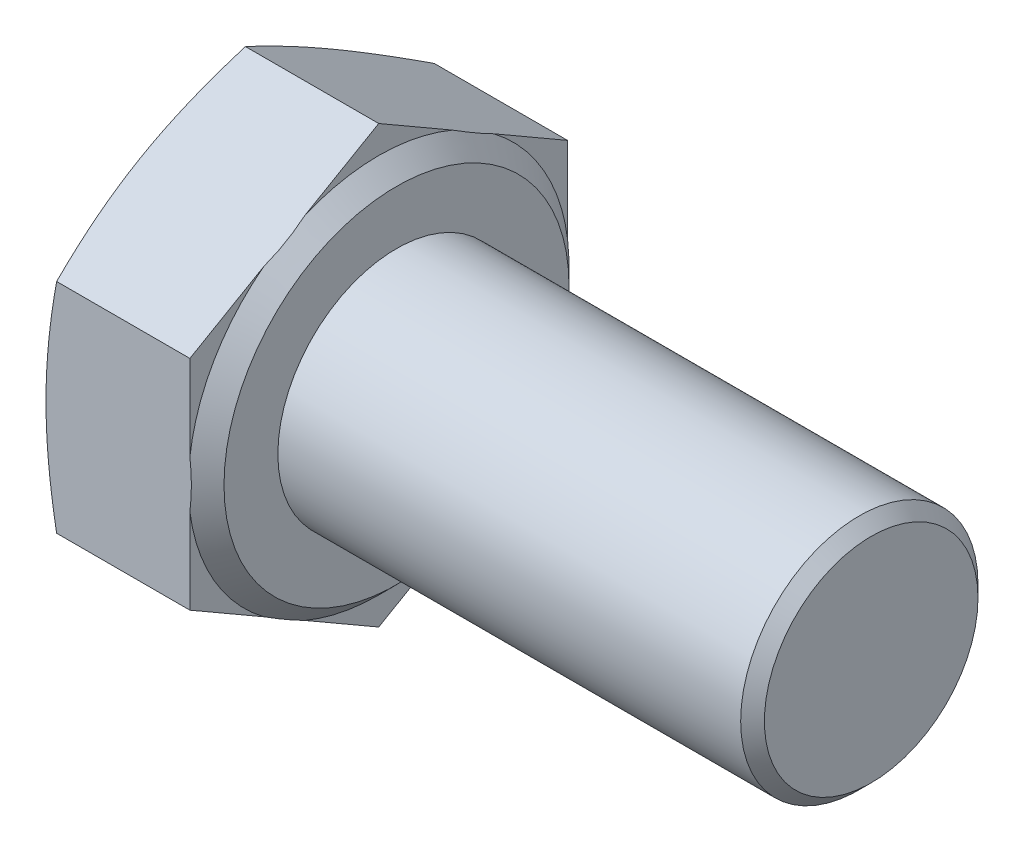
ISO-10303-21;
HEADER;
FILE_DESCRIPTION(('STEP AP214'),'2;1');
FILE_NAME('part.step','',(''),(''),'','','');
FILE_SCHEMA(('AUTOMOTIVE_DESIGN { 1 0 10303 214 1 1 1 1 }'));
ENDSEC;
DATA;
#1=APPLICATION_CONTEXT('core data for automotive mechanical design processes');
#2=APPLICATION_PROTOCOL_DEFINITION('international standard','automotive_design',2000,#1);
#3=PRODUCT_CONTEXT('',#1,'mechanical');
#4=PRODUCT('Part','Part','',(#3));
#5=PRODUCT_RELATED_PRODUCT_CATEGORY('part','',(#4));
#6=PRODUCT_DEFINITION_FORMATION('','',#4);
#7=PRODUCT_DEFINITION_CONTEXT('part definition',#1,'design');
#8=PRODUCT_DEFINITION('design','',#6,#7);
#9=PRODUCT_DEFINITION_SHAPE('','',#8);
#10=(LENGTH_UNIT() NAMED_UNIT(*) SI_UNIT(.MILLI.,.METRE.));
#11=(NAMED_UNIT(*) PLANE_ANGLE_UNIT() SI_UNIT($,.RADIAN.));
#12=(NAMED_UNIT(*) SI_UNIT($,.STERADIAN.) SOLID_ANGLE_UNIT());
#13=UNCERTAINTY_MEASURE_WITH_UNIT(LENGTH_MEASURE(1.E-05),#10,'distance_accuracy_value','');
#14=(GEOMETRIC_REPRESENTATION_CONTEXT(3) GLOBAL_UNCERTAINTY_ASSIGNED_CONTEXT((#13)) GLOBAL_UNIT_ASSIGNED_CONTEXT((#10,
#11,#12)) REPRESENTATION_CONTEXT('',''));
#15=CARTESIAN_POINT('',(0.,0.,0.));
#16=DIRECTION('',(0.,0.,1.));
#17=DIRECTION('',(1.,0.,0.));
#18=AXIS2_PLACEMENT_3D('',#15,#16,#17);
#19=CARTESIAN_POINT('',(5.45,-3.67483446339197,-6.365));
#20=DIRECTION('',(1.,0.,0.));
#21=DIRECTION('',(0.,0.,-1.));
#22=AXIS2_PLACEMENT_3D('',#19,#20,#21);
#23=PLANE('',#22);
#24=CARTESIAN_POINT('',(5.45,0.,0.));
#25=DIRECTION('',(-1.,0.,0.));
#26=DIRECTION('',(0.,0.,1.));
#27=AXIS2_PLACEMENT_3D('',#24,#25,#26);
#28=CIRCLE('',#27,5.815);
#29=CARTESIAN_POINT('',(5.45,0.,5.815));
#30=VERTEX_POINT('',#29);
#31=EDGE_CURVE('E368',#30,#30,#28,.T.);
#32=ORIENTED_EDGE('',*,*,#31,.F.);
#33=EDGE_LOOP('',(#32));
#34=FACE_BOUND('',#33,.T.);
#35=CARTESIAN_POINT('',(5.45,0.,0.));
#36=DIRECTION('',(1.,0.,0.));
#37=DIRECTION('',(0.,0.,-1.));
#38=AXIS2_PLACEMENT_3D('',#35,#36,#37);
#39=CIRCLE('',#38,4.);
#40=CARTESIAN_POINT('',(5.45,0.,-4.));
#41=VERTEX_POINT('',#40);
#42=EDGE_CURVE('E371',#41,#41,#39,.T.);
#43=ORIENTED_EDGE('',*,*,#42,.F.);
#44=EDGE_LOOP('',(#43));
#45=FACE_BOUND('',#44,.T.);
#46=ADVANCED_FACE('F43',(#34,#45),#23,.T.);
#47=CARTESIAN_POINT('',(5.45,-7.34966892678394,0.));
#48=DIRECTION('',(0.,0.866025403784439,0.5));
#49=DIRECTION('',(0.,-0.5,0.866025403784439));
#50=AXIS2_PLACEMENT_3D('',#47,#48,#49);
#51=PLANE('',#50);
#52=CARTESIAN_POINT('',(0.358432208609163,-3.67471899333813,-6.3652));
#53=CARTESIAN_POINT('',(0.303017853386462,-3.82691148046277,-6.10159487976986));
#54=CARTESIAN_POINT('',(0.252608898537303,-3.9796058343014,-5.83712050089245));
#55=CARTESIAN_POINT('',(0.163922131489335,-4.28598738129872,-5.30645209499153));
#56=CARTESIAN_POINT('',(0.125653812123521,-4.43967525596498,-5.0402568875623));
#57=CARTESIAN_POINT('',(0.0637558982239277,-4.74633825306905,-4.50910099577671));
#58=CARTESIAN_POINT('',(0.0399912941880052,-4.8993063719615,-4.24415244191675));
#59=CARTESIAN_POINT('',(0.0081162800509403,-5.2056003294291,-3.71363574553151));
#60=CARTESIAN_POINT('',(0.,-5.35892601225853,-3.44806787276575));
#61=CARTESIAN_POINT('',(0.,-5.66557737791738,-2.91693212723424));
#62=CARTESIAN_POINT('',(0.00811628005094046,-5.81890306074681,-2.65136425446848));
#63=CARTESIAN_POINT('',(0.0399912941880055,-6.12519701821441,-2.12084755808325));
#64=CARTESIAN_POINT('',(0.0637558982239282,-6.27816513710686,-1.85589900422329));
#65=CARTESIAN_POINT('',(0.125653812123521,-6.58482813421093,-1.3247431124377));
#66=CARTESIAN_POINT('',(0.163922131489335,-6.73851600887719,-1.05854790500846));
#67=CARTESIAN_POINT('',(0.252608898537303,-7.04489755587451,-0.527879499107549));
#68=CARTESIAN_POINT('',(0.303017853386462,-7.19759190971314,-0.263405120230136));
#69=CARTESIAN_POINT('',(0.358432208609164,-7.34978439683778,0.000200000000003));
#70=B_SPLINE_CURVE_WITH_KNOTS('',3,(#52,#53,#54,#55,#56,#57,#58,#59,#60,#61,#62,#63,#64,#65,#66,
#67,#68,#69),.UNSPECIFIED.,.F.,.F.,(4,2,2,2,2,2,2,2,4),(0.,0.928259882660236,1.85724379836754,
2.77744274027351,3.69729643285266,4.6171501254318,5.53734906733777,6.46633298304508,
7.39459286570531),.UNSPECIFIED.);
#71=CARTESIAN_POINT('',(0.358390179956193,-3.67483446339197,-6.365));
#72=VERTEX_POINT('',#71);
#73=CARTESIAN_POINT('',(0.,-5.51225169508795,-3.1825));
#74=VERTEX_POINT('',#73);
#75=EDGE_CURVE('E157',#72,#74,#70,.T.);
#76=ORIENTED_EDGE('',*,*,#75,.F.);
#77=DIRECTION('',(-1.,0.,0.));
#78=VECTOR('',#77,1.);
#79=CARTESIAN_POINT('',(5.45,-3.67483446339197,-6.365));
#80=LINE('',#79,#78);
#81=CARTESIAN_POINT('',(4.85,-3.67483446339197,-6.365));
#82=VERTEX_POINT('',#81);
#83=EDGE_CURVE('E186',#82,#72,#80,.T.);
#84=ORIENTED_EDGE('',*,*,#83,.F.);
#85=DIRECTION('',(0.,0.5,-0.866025403784439));
#86=VECTOR('',#85,1.);
#87=CARTESIAN_POINT('',(4.85,-7.34966892678394,0.));
#88=LINE('',#87,#86);
#89=CARTESIAN_POINT('',(4.85,-5.11256431725371,-3.8747788455529));
#90=VERTEX_POINT('',#89);
#91=EDGE_CURVE('E408',#90,#82,#88,.T.);
#92=ORIENTED_EDGE('',*,*,#91,.F.);
#93=CARTESIAN_POINT('',(4.8498,-5.91274078357853,-2.48883255085737));
#94=CARTESIAN_POINT('',(4.86645104578208,-5.84620990023086,-2.60406742108797));
#95=CARTESIAN_POINT('',(4.8790176064367,-5.77941769363162,-2.71975491646751));
#96=CARTESIAN_POINT('',(4.8957758431454,-5.64583354605376,-2.95112944715814));
#97=CARTESIAN_POINT('',(4.9,-5.57904262057086,-3.06681472357907));
#98=CARTESIAN_POINT('',(4.9,-5.44546076960505,-3.29818527642093));
#99=CARTESIAN_POINT('',(4.8957758431454,-5.37866984412215,-3.41387055284186));
#100=CARTESIAN_POINT('',(4.8790176064367,-5.24508569654429,-3.64524508353249));
#101=CARTESIAN_POINT('',(4.86645104578208,-5.17829348994505,-3.76093257891203));
#102=CARTESIAN_POINT('',(4.8498,-5.11176260659738,-3.87616744914263));
#103=B_SPLINE_CURVE_WITH_KNOTS('',3,(#93,#94,#95,#96,#97,#98,#99,#100,#101,#102),.UNSPECIFIED.,
.F.,.F.,(4,2,2,2,4),(0.,0.402253789710968,0.802938309087774,1.20362282846458,1.60587661817555),.UNSPECIFIED.);
#104=CARTESIAN_POINT('',(4.85,-5.9119390729222,-2.4902211544471));
#105=VERTEX_POINT('',#104);
#106=EDGE_CURVE('E299',#105,#90,#103,.T.);
#107=ORIENTED_EDGE('',*,*,#106,.F.);
#108=CARTESIAN_POINT('',(4.85,-7.34966892678394,0.));
#109=VERTEX_POINT('',#108);
#110=EDGE_CURVE('E413',#109,#105,#88,.T.);
#111=ORIENTED_EDGE('',*,*,#110,.F.);
#112=DIRECTION('',(-1.,0.,0.));
#113=VECTOR('',#112,1.);
#114=CARTESIAN_POINT('',(5.45,-7.34966892678394,0.));
#115=LINE('',#114,#113);
#116=CARTESIAN_POINT('',(0.358390179956193,-7.34966892678394,0.));
#117=VERTEX_POINT('',#116);
#118=EDGE_CURVE('E180',#109,#117,#115,.T.);
#119=ORIENTED_EDGE('',*,*,#118,.T.);
#120=EDGE_CURVE('E211',#74,#117,#70,.T.);
#121=ORIENTED_EDGE('',*,*,#120,.F.);
#122=EDGE_LOOP('',(#76,#84,#92,#107,#111,#119,#121));
#123=FACE_BOUND('',#122,.T.);
#124=ADVANCED_FACE('F226',(#123),#51,.F.);
#125=CARTESIAN_POINT('',(5.45,-3.67483446339197,-6.365));
#126=DIRECTION('',(0.,0.,1.));
#127=DIRECTION('',(0.,-1.,0.));
#128=AXIS2_PLACEMENT_3D('',#125,#126,#127);
#129=PLANE('',#128);
#130=CARTESIAN_POINT('',(1.9150953359124,-9.72967062799653,-6.365));
#131=CARTESIAN_POINT('',(1.82740685310746,-9.44169496681688,-6.365));
#132=CARTESIAN_POINT('',(1.74074158058572,-9.1534019459294,-6.365));
#133=CARTESIAN_POINT('',(1.57002349461601,-8.57601961509125,-6.365));
#134=CARTESIAN_POINT('',(1.48597088789315,-8.28693024409015,-6.365));
#135=CARTESIAN_POINT('',(1.320904351253,-7.70729883573411,-6.365));
#136=CARTESIAN_POINT('',(1.23989638334084,-7.41675509439314,-6.365));
#137=CARTESIAN_POINT('',(1.08186750694324,-6.83458682179727,-6.365));
#138=CARTESIAN_POINT('',(1.0048465268705,-6.54296231004867,-6.365));
#139=CARTESIAN_POINT('',(0.856698011009505,-5.96204179886127,-6.365));
#140=CARTESIAN_POINT('',(0.785509520514272,-5.67276142172824,-6.365));
#141=CARTESIAN_POINT('',(0.64919338600521,-5.09276117088984,-6.365));
#142=CARTESIAN_POINT('',(0.584065843988246,-4.80204127304613,-6.365));
#143=CARTESIAN_POINT('',(0.46138999454005,-4.21909692928575,-6.365));
#144=CARTESIAN_POINT('',(0.40383910172558,-3.92687303213234,-6.365));
#145=CARTESIAN_POINT('',(0.298068957571553,-3.34072867531993,-6.365));
#146=CARTESIAN_POINT('',(0.249849393577954,-3.04680827284371,-6.365));
#147=CARTESIAN_POINT('',(0.169475269694194,-2.49036754805804,-6.365));
#148=CARTESIAN_POINT('',(0.136125668658571,-2.22802146437677,-6.365));
#149=CARTESIAN_POINT('',(0.0796727381155356,-1.70221996764774,-6.365));
#150=CARTESIAN_POINT('',(0.056569110029888,-1.43876458715193,-6.365));
#151=CARTESIAN_POINT('',(0.021720748744109,-0.911278881401202,-6.365));
#152=CARTESIAN_POINT('',(0.0099679812278457,-0.647249095585918,-6.365));
#153=CARTESIAN_POINT('',(-0.00158361869585276,-0.118925367790678,-6.365));
#154=CARTESIAN_POINT('',(-0.00138253552102556,0.145368572310647,-6.365));
#155=CARTESIAN_POINT('',(0.0109939459696761,0.675012376388833,-6.365));
#156=CARTESIAN_POINT('',(0.023230066897016,0.940360797807836,-6.365));
#157=CARTESIAN_POINT('',(0.0591135147245862,1.47027824625194,-6.365));
#158=CARTESIAN_POINT('',(0.0827611157780153,1.73484725439851,-6.365));
#159=CARTESIAN_POINT('',(0.14036130005099,2.26307523643802,-6.365));
#160=CARTESIAN_POINT('',(0.174322734401913,2.52673323118344,-6.365));
#161=CARTESIAN_POINT('',(0.251173018988131,3.0527302030477,-6.365));
#162=CARTESIAN_POINT('',(0.294061917071763,3.31506917308927,-6.365));
#163=CARTESIAN_POINT('',(0.38983930060547,3.85223310239566,-6.365));
#164=CARTESIAN_POINT('',(0.443136722334723,4.12698449767404,-6.365));
#165=CARTESIAN_POINT('',(0.556591286147287,4.67507636809316,-6.365));
#166=CARTESIAN_POINT('',(0.616748945391973,4.94841673523732,-6.365));
#167=CARTESIAN_POINT('',(0.742660698049468,5.49388136539487,-6.365));
#168=CARTESIAN_POINT('',(0.808416416790574,5.76600525091521,-6.365));
#169=CARTESIAN_POINT('',(0.944454997915681,6.30910658112766,-6.365));
#170=CARTESIAN_POINT('',(1.01473775178792,6.5800840531332,-6.365));
#171=CARTESIAN_POINT('',(1.15907513489816,7.1214003341308,-6.365));
#172=CARTESIAN_POINT('',(1.23313447339427,7.39173788299648,-6.365));
#173=CARTESIAN_POINT('',(1.38427063377748,7.93156975409727,-6.365));
#174=CARTESIAN_POINT('',(1.46134750009957,8.20106406385202,-6.365));
#175=CARTESIAN_POINT('',(1.69623888685744,9.00837522016197,-6.365));
#176=CARTESIAN_POINT('',(1.85774082741465,9.5451184822027,-6.365));
#177=CARTESIAN_POINT('',(2.18566531874294,10.6106004903992,-6.365));
#178=CARTESIAN_POINT('',(2.35201388027535,11.1393621956269,-6.365));
#179=CARTESIAN_POINT('',(2.68943698081584,12.1954003383252,-6.365));
#180=CARTESIAN_POINT('',(2.86051174657033,12.7226767031926,-6.36499999999999));
#181=CARTESIAN_POINT('',(3.20545948603472,13.7740950439574,-6.36499999999999));
#182=CARTESIAN_POINT('',(3.37931937943151,14.298241321587,-6.36499999999999));
#183=CARTESIAN_POINT('',(3.64203864055547,15.0837906039833,-6.36499999999999));
#184=CARTESIAN_POINT('',(3.72992971843083,15.3455181461989,-6.36499999999999));
#185=CARTESIAN_POINT('',(3.90628058973421,15.8687808819846,-6.36499999999999));
#186=CARTESIAN_POINT('',(3.99474038177596,16.1303160760218,-6.36499999999999));
#187=CARTESIAN_POINT('',(4.08344640915735,16.3917677152,-6.36499999999999));
#188=B_SPLINE_CURVE_WITH_KNOTS('',3,(#130,#131,#132,#133,#134,#135,#136,#137,#138,#139,#140,
#141,#142,#143,#144,#145,#146,#147,#148,#149,#150,#151,#152,#153,#154,#155,#156,#157,#158,#159,
#160,#161,#162,#163,#164,#165,#166,#167,#168,#169,#170,#171,#172,#173,#174,#175,#176,#177,#178,
#179,#180,#181,#182,#183,#184,#185,#186,#187),.UNSPECIFIED.,.F.,.F.,(4,2,2,2,2,2,2,2,2,2,2,2,2,
2,2,2,2,2,2,2,2,2,2,2,2,2,2,2,4),(0.,0.903097347428738,1.8062659707617,2.7111196822492,
3.61595714123714,4.50963841789911,5.4033347311866,6.29672529327806,7.19008591638045,
7.98328363828434,8.77645824406809,9.56907101614613,10.3616781908171,11.1583050756945,
11.9549510999544,12.7522827315906,13.5496186367781,14.3891305208626,15.2287057337291,
16.0685255438015,16.9083252311134,17.7491990224401,18.5900852008205,20.271552402444,
21.9344598545306,23.5974472260011,25.2541246601636,26.0823966500058,26.910666621667),.UNSPECIFIED.);
#189=CARTESIAN_POINT('',(0.358390179956193,3.67483446339197,-6.365));
#190=VERTEX_POINT('',#189);
#191=CARTESIAN_POINT('',(0.,0.,-6.365));
#192=VERTEX_POINT('',#191);
#193=EDGE_CURVE('E276',#190,#192,#188,.F.);
#194=ORIENTED_EDGE('',*,*,#193,.F.);
#195=DIRECTION('',(-1.,0.,0.));
#196=VECTOR('',#195,1.);
#197=CARTESIAN_POINT('',(5.45,3.67483446339197,-6.365));
#198=LINE('',#197,#196);
#199=CARTESIAN_POINT('',(4.85,3.67483446339197,-6.365));
#200=VERTEX_POINT('',#199);
#201=EDGE_CURVE('E177',#200,#190,#198,.T.);
#202=ORIENTED_EDGE('',*,*,#201,.F.);
#203=DIRECTION('',(0.,1.,0.));
#204=VECTOR('',#203,1.);
#205=CARTESIAN_POINT('',(4.85,-3.67483446339197,-6.365));
#206=LINE('',#205,#204);
#207=CARTESIAN_POINT('',(4.85,0.799374755668522,-6.365));
#208=VERTEX_POINT('',#207);
#209=EDGE_CURVE('E414',#208,#200,#206,.T.);
#210=ORIENTED_EDGE('',*,*,#209,.F.);
#211=CARTESIAN_POINT('',(4.03279951704434,-3.43387519075233,-6.365));
#212=CARTESIAN_POINT('',(4.12915263849273,-3.23085023011694,-6.365));
#213=CARTESIAN_POINT('',(4.22025748585871,-3.02511909944975,-6.365));
#214=CARTESIAN_POINT('',(4.38924442875649,-2.607586142848,-6.365));
#215=CARTESIAN_POINT('',(4.46708471573415,-2.39576749483417,-6.365));
#216=CARTESIAN_POINT('',(4.60570873768971,-1.96811964987368,-6.365));
#217=CARTESIAN_POINT('',(4.66660505783177,-1.75232760532108,-6.365));
#218=CARTESIAN_POINT('',(4.76875528549822,-1.31633465245685,-6.365));
#219=CARTESIAN_POINT('',(4.81003455600802,-1.09613982269909,-6.365));
#220=CARTESIAN_POINT('',(4.86166598674748,-0.716857278788027,-6.365));
#221=CARTESIAN_POINT('',(4.87750915855413,-0.558507647439388,-6.365));
#222=CARTESIAN_POINT('',(4.89740688876809,-0.241033868209288,-6.365));
#223=CARTESIAN_POINT('',(4.90146005034603,-0.0819096307926899,-6.365));
#224=CARTESIAN_POINT('',(4.89760366254159,0.236307876778583,-6.365));
#225=CARTESIAN_POINT('',(4.88968544851061,0.395401041070628,-6.365));
#226=CARTESIAN_POINT('',(4.86219166047059,0.712536056449976,-6.365));
#227=CARTESIAN_POINT('',(4.84261749559239,0.870578032284362,-6.365));
#228=CARTESIAN_POINT('',(4.77989629912372,1.26397857327129,-6.365));
#229=CARTESIAN_POINT('',(4.72984501952514,1.49825109784234,-6.365));
#230=CARTESIAN_POINT('',(4.60840439500463,1.9614286646662,-6.365));
#231=CARTESIAN_POINT('',(4.5369824002411,2.19032491185728,-6.365));
#232=CARTESIAN_POINT('',(4.37639278374582,2.64284924670944,-6.365));
#233=CARTESIAN_POINT('',(4.28714977555017,2.866450279519,-6.365));
#234=CARTESIAN_POINT('',(4.14298757672639,3.1968115005545,-6.365));
#235=CARTESIAN_POINT('',(4.09331043783535,3.30591051664446,-6.365));
#236=CARTESIAN_POINT('',(3.99087238919469,3.52261302856448,-6.365));
#237=CARTESIAN_POINT('',(3.93811240732307,3.63021696243972,-6.365));
#238=CARTESIAN_POINT('',(3.88398571887172,3.73713082701422,-6.365));
#239=B_SPLINE_CURVE_WITH_KNOTS('',3,(#211,#212,#213,#214,#215,#216,#217,#218,#219,#220,#221,
#222,#223,#224,#225,#226,#227,#228,#229,#230,#231,#232,#233,#234,#235,#236,#237,#238),
.UNSPECIFIED.,.F.,.F.,(4,2,2,2,2,2,2,2,2,2,2,2,2,4),(0.,0.674405155060001,1.35089815376226,
2.02278254460677,2.69379587324144,3.17081389671399,3.64788843291527,4.1253084317203,
4.60267072517736,5.32008921030018,6.03860940161102,6.76023604416636,7.11982798490662,
7.47931224719879),.UNSPECIFIED.);
#240=CARTESIAN_POINT('',(4.85,-0.799374755668519,-6.365));
#241=VERTEX_POINT('',#240);
#242=EDGE_CURVE('E292',#241,#208,#239,.T.);
#243=ORIENTED_EDGE('',*,*,#242,.F.);
#244=EDGE_CURVE('E410',#82,#241,#206,.T.);
#245=ORIENTED_EDGE('',*,*,#244,.F.);
#246=ORIENTED_EDGE('',*,*,#83,.T.);
#247=EDGE_CURVE('E168',#192,#72,#188,.F.);
#248=ORIENTED_EDGE('',*,*,#247,.F.);
#249=EDGE_LOOP('',(#194,#202,#210,#243,#245,#246,#248));
#250=FACE_BOUND('',#249,.T.);
#251=ADVANCED_FACE('F284',(#250),#129,.F.);
#252=CARTESIAN_POINT('',(5.45,3.67483446339197,-6.365));
#253=DIRECTION('',(0.,-0.866025403784439,0.5));
#254=DIRECTION('',(0.,-0.5,-0.866025403784439));
#255=AXIS2_PLACEMENT_3D('',#252,#253,#254);
#256=PLANE('',#255);
#257=CARTESIAN_POINT('',(0.358432208609163,7.34978439683778,0.000199999999999818));
#258=CARTESIAN_POINT('',(0.303017853386462,7.19759190971314,-0.263405120230138));
#259=CARTESIAN_POINT('',(0.252608898537303,7.04489755587451,-0.527879499107552));
#260=CARTESIAN_POINT('',(0.163922131489335,6.73851600887719,-1.05854790500846));
#261=CARTESIAN_POINT('',(0.125653812123521,6.58482813421093,-1.3247431124377));
#262=CARTESIAN_POINT('',(0.0637558982239282,6.27816513710686,-1.85589900422329));
#263=CARTESIAN_POINT('',(0.0399912941880056,6.12519701821441,-2.12084755808325));
#264=CARTESIAN_POINT('',(0.0081162800509405,5.81890306074681,-2.65136425446849));
#265=CARTESIAN_POINT('',(0.,5.66557737791738,-2.91693212723424));
#266=CARTESIAN_POINT('',(0.,5.35892601225853,-3.44806787276575));
#267=CARTESIAN_POINT('',(0.00811628005094041,5.2056003294291,-3.71363574553151));
#268=CARTESIAN_POINT('',(0.0399912941880053,4.8993063719615,-4.24415244191675));
#269=CARTESIAN_POINT('',(0.0637558982239276,4.74633825306905,-4.50910099577671));
#270=CARTESIAN_POINT('',(0.12565381212352,4.43967525596498,-5.0402568875623));
#271=CARTESIAN_POINT('',(0.163922131489334,4.28598738129872,-5.30645209499153));
#272=CARTESIAN_POINT('',(0.252608898537302,3.9796058343014,-5.83712050089245));
#273=CARTESIAN_POINT('',(0.303017853386461,3.82691148046277,-6.10159487976986));
#274=CARTESIAN_POINT('',(0.358432208609162,3.67471899333813,-6.3652));
#275=B_SPLINE_CURVE_WITH_KNOTS('',3,(#257,#258,#259,#260,#261,#262,#263,#264,#265,#266,#267,
#268,#269,#270,#271,#272,#273,#274),.UNSPECIFIED.,.F.,.F.,(4,2,2,2,2,2,2,2,4),(0.,
0.928259882660236,1.85724379836754,2.77744274027351,3.69729643285265,4.61715012543179,
5.53734906733776,6.46633298304507,7.39459286570531),.UNSPECIFIED.);
#276=CARTESIAN_POINT('',(0.358390179956193,7.34966892678394,0.));
#277=VERTEX_POINT('',#276);
#278=CARTESIAN_POINT('',(0.,5.51225169508795,-3.1825));
#279=VERTEX_POINT('',#278);
#280=EDGE_CURVE('E58',#277,#279,#275,.T.);
#281=ORIENTED_EDGE('',*,*,#280,.F.);
#282=DIRECTION('',(-1.,0.,0.));
#283=VECTOR('',#282,1.);
#284=CARTESIAN_POINT('',(5.45,7.34966892678394,0.));
#285=LINE('',#284,#283);
#286=CARTESIAN_POINT('',(4.85,7.34966892678394,0.));
#287=VERTEX_POINT('',#286);
#288=EDGE_CURVE('E174',#287,#277,#285,.T.);
#289=ORIENTED_EDGE('',*,*,#288,.F.);
#290=DIRECTION('',(0.,0.5,0.866025403784439));
#291=VECTOR('',#290,1.);
#292=CARTESIAN_POINT('',(4.85,3.67483446339197,-6.365));
#293=LINE('',#292,#291);
#294=CARTESIAN_POINT('',(4.85,5.91193907292219,-2.49022115444712));
#295=VERTEX_POINT('',#294);
#296=EDGE_CURVE('E438',#295,#287,#293,.T.);
#297=ORIENTED_EDGE('',*,*,#296,.F.);
#298=CARTESIAN_POINT('',(4.8498,5.11176260659738,-3.87616744914263));
#299=CARTESIAN_POINT('',(4.86645104578208,5.17829348994505,-3.76093257891203));
#300=CARTESIAN_POINT('',(4.8790176064367,5.24508569654429,-3.64524508353249));
#301=CARTESIAN_POINT('',(4.8957758431454,5.37866984412215,-3.41387055284186));
#302=CARTESIAN_POINT('',(4.9,5.44546076960505,-3.29818527642093));
#303=CARTESIAN_POINT('',(4.9,5.57904262057086,-3.06681472357907));
#304=CARTESIAN_POINT('',(4.8957758431454,5.64583354605376,-2.95112944715813));
#305=CARTESIAN_POINT('',(4.8790176064367,5.77941769363162,-2.7197549164675));
#306=CARTESIAN_POINT('',(4.86645104578208,5.84620990023087,-2.60406742108797));
#307=CARTESIAN_POINT('',(4.8498,5.91274078357853,-2.48883255085737));
#308=B_SPLINE_CURVE_WITH_KNOTS('',3,(#298,#299,#300,#301,#302,#303,#304,#305,#306,#307),
.UNSPECIFIED.,.F.,.F.,(4,2,2,2,4),(0.,0.402253789710969,0.802938309087776,1.20362282846458,
1.60587661817555),.UNSPECIFIED.);
#309=CARTESIAN_POINT('',(4.85,5.11256431725372,-3.87477884555288));
#310=VERTEX_POINT('',#309);
#311=EDGE_CURVE('E300',#310,#295,#308,.T.);
#312=ORIENTED_EDGE('',*,*,#311,.F.);
#313=EDGE_CURVE('E433',#200,#310,#293,.T.);
#314=ORIENTED_EDGE('',*,*,#313,.F.);
#315=ORIENTED_EDGE('',*,*,#201,.T.);
#316=EDGE_CURVE('E277',#279,#190,#275,.T.);
#317=ORIENTED_EDGE('',*,*,#316,.F.);
#318=EDGE_LOOP('',(#281,#289,#297,#312,#314,#315,#317));
#319=FACE_BOUND('',#318,.T.);
#320=ADVANCED_FACE('F287',(#319),#256,.F.);
#321=CARTESIAN_POINT('',(5.45,7.34966892678394,0.));
#322=DIRECTION('',(0.,-0.866025403784439,-0.5));
#323=DIRECTION('',(0.,0.5,-0.866025403784439));
#324=AXIS2_PLACEMENT_3D('',#321,#322,#323);
#325=PLANE('',#324);
#326=CARTESIAN_POINT('',(0.358432208609163,3.67471899333813,6.3652));
#327=CARTESIAN_POINT('',(0.303017853386463,3.82691148046277,6.10159487976986));
#328=CARTESIAN_POINT('',(0.252608898537304,3.9796058343014,5.83712050089245));
#329=CARTESIAN_POINT('',(0.163922131489335,4.28598738129872,5.30645209499154));
#330=CARTESIAN_POINT('',(0.125653812123521,4.43967525596498,5.0402568875623));
#331=CARTESIAN_POINT('',(0.0637558982239281,4.74633825306905,4.50910099577671));
#332=CARTESIAN_POINT('',(0.0399912941880057,4.8993063719615,4.24415244191675));
#333=CARTESIAN_POINT('',(0.0081162800509408,5.2056003294291,3.71363574553151));
#334=CARTESIAN_POINT('',(0.,5.35892601225853,3.44806787276576));
#335=CARTESIAN_POINT('',(0.,5.66557737791738,2.91693212723424));
#336=CARTESIAN_POINT('',(0.00811628005094083,5.81890306074681,2.65136425446849));
#337=CARTESIAN_POINT('',(0.0399912941880058,6.12519701821441,2.12084755808325));
#338=CARTESIAN_POINT('',(0.0637558982239282,6.27816513710686,1.85589900422329));
#339=CARTESIAN_POINT('',(0.125653812123521,6.58482813421093,1.3247431124377));
#340=CARTESIAN_POINT('',(0.163922131489335,6.73851600887719,1.05854790500846));
#341=CARTESIAN_POINT('',(0.252608898537303,7.04489755587451,0.52787949910755));
#342=CARTESIAN_POINT('',(0.303017853386463,7.19759190971314,0.263405120230137));
#343=CARTESIAN_POINT('',(0.358432208609163,7.34978439683778,-0.000200000000001454));
#344=B_SPLINE_CURVE_WITH_KNOTS('',3,(#326,#327,#328,#329,#330,#331,#332,#333,#334,#335,#336,
#337,#338,#339,#340,#341,#342,#343),.UNSPECIFIED.,.F.,.F.,(4,2,2,2,2,2,2,2,4),(0.,
0.928259882660236,1.85724379836754,2.77744274027351,3.69729643285266,4.6171501254318,
5.53734906733777,6.46633298304507,7.39459286570531),.UNSPECIFIED.);
#345=CARTESIAN_POINT('',(0.358390179956193,3.67483446339197,6.365));
#346=VERTEX_POINT('',#345);
#347=CARTESIAN_POINT('',(0.,5.51225169508795,3.1825));
#348=VERTEX_POINT('',#347);
#349=EDGE_CURVE('E66',#346,#348,#344,.T.);
#350=ORIENTED_EDGE('',*,*,#349,.F.);
#351=DIRECTION('',(-1.,0.,0.));
#352=VECTOR('',#351,1.);
#353=CARTESIAN_POINT('',(5.45,3.67483446339197,6.365));
#354=LINE('',#353,#352);
#355=CARTESIAN_POINT('',(4.85,3.67483446339197,6.365));
#356=VERTEX_POINT('',#355);
#357=EDGE_CURVE('E165',#356,#346,#354,.T.);
#358=ORIENTED_EDGE('',*,*,#357,.F.);
#359=DIRECTION('',(0.,-0.5,0.866025403784439));
#360=VECTOR('',#359,1.);
#361=CARTESIAN_POINT('',(4.85,7.34966892678394,0.));
#362=LINE('',#361,#360);
#363=CARTESIAN_POINT('',(4.85,5.11256431725371,3.87477884555289));
#364=VERTEX_POINT('',#363);
#365=EDGE_CURVE('E445',#364,#356,#362,.T.);
#366=ORIENTED_EDGE('',*,*,#365,.F.);
#367=CARTESIAN_POINT('',(4.8498,5.91274078357853,2.48883255085737));
#368=CARTESIAN_POINT('',(4.86645104578209,5.84620990023082,2.60406742108805));
#369=CARTESIAN_POINT('',(4.87901760643672,5.77941769363152,2.71975491646767));
#370=CARTESIAN_POINT('',(4.89577584314542,5.64583354605357,2.95112944715846));
#371=CARTESIAN_POINT('',(4.90000000000002,5.57904262057062,3.06681472357947));
#372=CARTESIAN_POINT('',(4.89999999999999,5.44546076960473,3.2981852764215));
#373=CARTESIAN_POINT('',(4.89577584314537,5.37866984412178,3.41387055284251));
#374=CARTESIAN_POINT('',(4.87901760643663,5.24508569654383,3.6452450835333));
#375=CARTESIAN_POINT('',(4.86645104578197,5.17829348994453,3.76093257891291));
#376=CARTESIAN_POINT('',(4.84979999999986,5.11176260659682,3.87616744914359));
#377=B_SPLINE_CURVE_WITH_KNOTS('',3,(#367,#368,#369,#370,#371,#372,#373,#374,#375,#376),
.UNSPECIFIED.,.F.,.F.,(4,2,2,2,4),(0.,0.40225378971125,0.802938309088334,1.20362282846542,
1.60587661817667),.UNSPECIFIED.);
#378=CARTESIAN_POINT('',(4.85,5.9119390729222,2.49022115444711));
#379=VERTEX_POINT('',#378);
#380=EDGE_CURVE('E336',#379,#364,#377,.T.);
#381=ORIENTED_EDGE('',*,*,#380,.F.);
#382=EDGE_CURVE('E444',#287,#379,#362,.T.);
#383=ORIENTED_EDGE('',*,*,#382,.F.);
#384=ORIENTED_EDGE('',*,*,#288,.T.);
#385=EDGE_CURVE('E167',#348,#277,#344,.T.);
#386=ORIENTED_EDGE('',*,*,#385,.F.);
#387=EDGE_LOOP('',(#350,#358,#366,#381,#383,#384,#386));
#388=FACE_BOUND('',#387,.T.);
#389=ADVANCED_FACE('F163',(#388),#325,.F.);
#390=CARTESIAN_POINT('',(5.45,3.67483446339197,6.365));
#391=DIRECTION('',(0.,0.,-1.));
#392=DIRECTION('',(-1.,0.,0.));
#393=AXIS2_PLACEMENT_3D('',#390,#391,#392);
#394=PLANE('',#393);
#395=CARTESIAN_POINT('',(1.91509499186738,-9.72966949844239,6.365));
#396=CARTESIAN_POINT('',(1.8274065254308,-9.44169388100942,6.365));
#397=CARTESIAN_POINT('',(1.74074126923368,-9.15340090389344,6.365));
#398=CARTESIAN_POINT('',(1.57002321571732,-8.57601866069177,6.365));
#399=CARTESIAN_POINT('',(1.48597062512316,-8.28692933355568,6.365));
#400=CARTESIAN_POINT('',(1.32090412051867,-7.70729801333673,6.365));
#401=CARTESIAN_POINT('',(1.23989616851068,-7.41675431626872,6.365));
#402=CARTESIAN_POINT('',(1.08186732342096,-6.83458613240286,6.365));
#403=CARTESIAN_POINT('',(1.00484635875195,-6.54296166511131,6.365));
#404=CARTESIAN_POINT('',(0.856697872735635,-5.96204124254702,6.365));
#405=CARTESIAN_POINT('',(0.785509396690931,-5.67276090957681,6.365));
#406=CARTESIAN_POINT('',(0.649193289931609,-5.09276074741788,6.365));
#407=CARTESIAN_POINT('',(0.584065761213718,-4.80204089409085,6.365));
#408=CARTESIAN_POINT('',(0.461389936625071,-4.21909663970474,6.365));
#409=CARTESIAN_POINT('',(0.403839055373966,-3.92687278740827,6.365));
#410=CARTESIAN_POINT('',(0.2980689318816,-3.34072852082149,6.365));
#411=CARTESIAN_POINT('',(0.249849376986923,-3.04680816371384,6.365));
#412=CARTESIAN_POINT('',(0.169475259692935,-2.49036747373219,6.365));
#413=CARTESIAN_POINT('',(0.136125658249983,-2.22802137917749,6.365));
#414=CARTESIAN_POINT('',(0.0796727278870326,-1.7022198606431,6.365));
#415=CARTESIAN_POINT('',(0.0565691003887714,-1.43876446921536,6.365));
#416=CARTESIAN_POINT('',(0.0217207413568147,-0.911278741623904,6.365));
#417=CARTESIAN_POINT('',(0.00996797550584933,-0.647248944899861,6.365));
#418=CARTESIAN_POINT('',(-0.00158362003896244,-0.118925195375246,6.365));
#419=CARTESIAN_POINT('',(-0.00138253415054946,0.145368755546696,6.365));
#420=CARTESIAN_POINT('',(0.0109939536907355,0.675012581557861,6.365));
#421=CARTESIAN_POINT('',(0.0232300782774913,0.940361014088011,6.365));
#422=CARTESIAN_POINT('',(0.0591135341292797,1.4702784845643,6.365));
#423=CARTESIAN_POINT('',(0.0827611395476122,1.7348475036319,6.365));
#424=CARTESIAN_POINT('',(0.140361333008319,2.26307550737217,6.365));
#425=CARTESIAN_POINT('',(0.174322772183802,2.52673351289701,6.365));
#426=CARTESIAN_POINT('',(0.251173066655278,3.05273050616951,6.365));
#427=CARTESIAN_POINT('',(0.294061969799616,3.3150694868399,6.365));
#428=CARTESIAN_POINT('',(0.389839361833372,3.85223342679727,6.365));
#429=CARTESIAN_POINT('',(0.443136786671216,4.1269848221522,6.365));
#430=CARTESIAN_POINT('',(0.556591356183901,4.6750766927594,6.365));
#431=CARTESIAN_POINT('',(0.616749018019996,4.94841706001512,6.365));
#432=CARTESIAN_POINT('',(0.742660775422187,5.49388169043514,6.365));
#433=CARTESIAN_POINT('',(0.808416496316159,5.76600557610649,6.365));
#434=CARTESIAN_POINT('',(0.944455081390747,6.30910690667981,6.365));
#435=CARTESIAN_POINT('',(1.01473783705962,6.5800843788952,6.365));
#436=CARTESIAN_POINT('',(1.15907522344911,7.12140066025617,6.365));
#437=CARTESIAN_POINT('',(1.23313456342593,7.39173820927584,6.365));
#438=CARTESIAN_POINT('',(1.38427072653872,7.93157008073459,6.365));
#439=CARTESIAN_POINT('',(1.46134759410965,8.20106439069329,6.365));
#440=CARTESIAN_POINT('',(1.6962389843436,9.00837554769518,6.365));
#441=CARTESIAN_POINT('',(1.85774092685404,9.54511881028884,6.365));
#442=CARTESIAN_POINT('',(2.18566542053363,10.6106008162262,6.365));
#443=CARTESIAN_POINT('',(2.35201398242584,11.1393625186539,6.365));
#444=CARTESIAN_POINT('',(2.6894370833329,12.1954006558518,6.365));
#445=CARTESIAN_POINT('',(2.8605118490941,12.7226770180188,6.365));
#446=CARTESIAN_POINT('',(3.2054595884782,13.7740953538946,6.365));
#447=CARTESIAN_POINT('',(3.37931948179169,14.2982416293346,6.365));
#448=CARTESIAN_POINT('',(3.64203874267391,15.0837909084871,6.365));
#449=CARTESIAN_POINT('',(3.72992982044977,15.3455184496299,6.365));
#450=CARTESIAN_POINT('',(3.90628069152081,15.8687811832806,6.365));
#451=CARTESIAN_POINT('',(3.99474048342974,16.1303163762558,6.365));
#452=CARTESIAN_POINT('',(4.08344651066458,16.3917680143764,6.365));
#453=B_SPLINE_CURVE_WITH_KNOTS('',3,(#395,#396,#397,#398,#399,#400,#401,#402,#403,#404,#405,
#406,#407,#408,#409,#410,#411,#412,#413,#414,#415,#416,#417,#418,#419,#420,#421,#422,#423,#424,
#425,#426,#427,#428,#429,#430,#431,#432,#433,#434,#435,#436,#437,#438,#439,#440,#441,#442,#443,
#444,#445,#446,#447,#448,#449,#450,#451,#452),.UNSPECIFIED.,.F.,.F.,(4,2,2,2,2,2,2,2,2,2,2,2,2,
2,2,2,2,2,2,2,2,2,2,2,2,2,2,2,4),(0.,0.903097207575023,1.80626569103696,2.71111926177276,
3.61595658001541,4.50963771767758,5.40333389194527,6.29672431533664,7.19008479979587,
7.98328255418382,8.77645719245087,9.56906999696307,10.3616772040682,11.1583041227231,
11.9549501807672,12.7522818463206,13.5496177854262,14.3891296715289,15.2287048864037,
16.0685246984409,16.9083243877203,17.7491981806695,18.5900843606705,20.2715515655816,
21.9344590099833,23.5974463737565,25.2541238016063,26.0823957883024,26.9106657568178),.UNSPECIFIED.);
#454=CARTESIAN_POINT('',(0.358390179956193,-3.67483446339197,6.365));
#455=VERTEX_POINT('',#454);
#456=CARTESIAN_POINT('',(0.,0.,6.365));
#457=VERTEX_POINT('',#456);
#458=EDGE_CURVE('E159',#455,#457,#453,.T.);
#459=ORIENTED_EDGE('',*,*,#458,.F.);
#460=DIRECTION('',(-1.,0.,0.));
#461=VECTOR('',#460,1.);
#462=CARTESIAN_POINT('',(5.45,-3.67483446339197,6.365));
#463=LINE('',#462,#461);
#464=CARTESIAN_POINT('',(4.85,-3.67483446339197,6.365));
#465=VERTEX_POINT('',#464);
#466=EDGE_CURVE('E175',#465,#455,#463,.T.);
#467=ORIENTED_EDGE('',*,*,#466,.F.);
#468=DIRECTION('',(0.,-1.,0.));
#469=VECTOR('',#468,1.);
#470=CARTESIAN_POINT('',(4.85,3.67483446339197,6.365));
#471=LINE('',#470,#469);
#472=CARTESIAN_POINT('',(4.85,-0.799374755668499,6.365));
#473=VERTEX_POINT('',#472);
#474=EDGE_CURVE('E385',#473,#465,#471,.T.);
#475=ORIENTED_EDGE('',*,*,#474,.F.);
#476=CARTESIAN_POINT('',(4.03279951704434,-3.43387519075233,6.365));
#477=CARTESIAN_POINT('',(4.12915263849273,-3.23085023011693,6.365));
#478=CARTESIAN_POINT('',(4.22025748585871,-3.02511909944975,6.365));
#479=CARTESIAN_POINT('',(4.38924442875649,-2.607586142848,6.365));
#480=CARTESIAN_POINT('',(4.46708471573415,-2.39576749483417,6.365));
#481=CARTESIAN_POINT('',(4.60570873768971,-1.96811964987368,6.365));
#482=CARTESIAN_POINT('',(4.66660505783177,-1.75232760532108,6.365));
#483=CARTESIAN_POINT('',(4.76875528549822,-1.31633465245685,6.365));
#484=CARTESIAN_POINT('',(4.81003455600801,-1.09613982269909,6.365));
#485=CARTESIAN_POINT('',(4.86166598674748,-0.716857278788024,6.365));
#486=CARTESIAN_POINT('',(4.87750915855413,-0.558507647439385,6.365));
#487=CARTESIAN_POINT('',(4.89740688876809,-0.241033868209285,6.365));
#488=CARTESIAN_POINT('',(4.90146005034603,-0.0819096307926868,6.365));
#489=CARTESIAN_POINT('',(4.89760366254159,0.236307876778586,6.365));
#490=CARTESIAN_POINT('',(4.8896854485106,0.395401041070631,6.365));
#491=CARTESIAN_POINT('',(4.86219166047059,0.712536056449979,6.365));
#492=CARTESIAN_POINT('',(4.84261749559239,0.870578032284365,6.365));
#493=CARTESIAN_POINT('',(4.77989629912372,1.26397857327129,6.365));
#494=CARTESIAN_POINT('',(4.72984501952514,1.49825109784234,6.365));
#495=CARTESIAN_POINT('',(4.60840439500463,1.9614286646662,6.365));
#496=CARTESIAN_POINT('',(4.53698240024109,2.19032491185728,6.365));
#497=CARTESIAN_POINT('',(4.37639278374581,2.64284924670944,6.365));
#498=CARTESIAN_POINT('',(4.28714977555017,2.866450279519,6.365));
#499=CARTESIAN_POINT('',(4.14298757672639,3.1968115005545,6.365));
#500=CARTESIAN_POINT('',(4.09331043783534,3.30591051664447,6.365));
#501=CARTESIAN_POINT('',(3.99087238919469,3.52261302856448,6.365));
#502=CARTESIAN_POINT('',(3.93811240732306,3.63021696243972,6.365));
#503=CARTESIAN_POINT('',(3.88398571887171,3.73713082701422,6.365));
#504=B_SPLINE_CURVE_WITH_KNOTS('',3,(#476,#477,#478,#479,#480,#481,#482,#483,#484,#485,#486,
#487,#488,#489,#490,#491,#492,#493,#494,#495,#496,#497,#498,#499,#500,#501,#502,#503),
.UNSPECIFIED.,.F.,.F.,(4,2,2,2,2,2,2,2,2,2,2,2,2,4),(0.,0.67440515506,1.35089815376226,
2.02278254460677,2.69379587324144,3.17081389671399,3.64788843291527,4.1253084317203,
4.60267072517737,5.32008921030019,6.03860940161102,6.76023604416636,7.11982798490662,
7.4793122471988),.UNSPECIFIED.);
#505=CARTESIAN_POINT('',(4.85,0.799374755668499,6.365));
#506=VERTEX_POINT('',#505);
#507=EDGE_CURVE('E330',#506,#473,#504,.F.);
#508=ORIENTED_EDGE('',*,*,#507,.F.);
#509=EDGE_CURVE('E173',#356,#506,#471,.T.);
#510=ORIENTED_EDGE('',*,*,#509,.F.);
#511=ORIENTED_EDGE('',*,*,#357,.T.);
#512=EDGE_CURVE('E149',#457,#346,#453,.T.);
#513=ORIENTED_EDGE('',*,*,#512,.F.);
#514=EDGE_LOOP('',(#459,#467,#475,#508,#510,#511,#513));
#515=FACE_BOUND('',#514,.T.);
#516=ADVANCED_FACE('F171',(#515),#394,.F.);
#517=CARTESIAN_POINT('',(5.45,-3.67483446339197,6.365));
#518=DIRECTION('',(0.,0.866025403784438,-0.5));
#519=DIRECTION('',(0.,0.5,0.866025403784439));
#520=AXIS2_PLACEMENT_3D('',#517,#518,#519);
#521=PLANE('',#520);
#522=CARTESIAN_POINT('',(0.358432208609163,-7.34978439683778,-0.000199999999997885));
#523=CARTESIAN_POINT('',(0.303017853386462,-7.19759190971314,0.26340512023014));
#524=CARTESIAN_POINT('',(0.252608898537303,-7.04489755587451,0.527879499107553));
#525=CARTESIAN_POINT('',(0.163922131489335,-6.73851600887719,1.05854790500847));
#526=CARTESIAN_POINT('',(0.125653812123521,-6.58482813421093,1.3247431124377));
#527=CARTESIAN_POINT('',(0.0637558982239281,-6.27816513710686,1.85589900422329));
#528=CARTESIAN_POINT('',(0.0399912941880055,-6.12519701821441,2.12084755808325));
#529=CARTESIAN_POINT('',(0.00811628005094065,-5.81890306074681,2.65136425446849));
#530=CARTESIAN_POINT('',(0.,-5.66557737791738,2.91693212723425));
#531=CARTESIAN_POINT('',(0.,-5.35892601225853,3.44806787276576));
#532=CARTESIAN_POINT('',(0.0081162800509408,-5.2056003294291,3.71363574553152));
#533=CARTESIAN_POINT('',(0.0399912941880056,-4.89930637196149,4.24415244191675));
#534=CARTESIAN_POINT('',(0.0637558982239281,-4.74633825306905,4.50910099577671));
#535=CARTESIAN_POINT('',(0.125653812123521,-4.43967525596498,5.0402568875623));
#536=CARTESIAN_POINT('',(0.163922131489335,-4.28598738129872,5.30645209499154));
#537=CARTESIAN_POINT('',(0.252608898537303,-3.9796058343014,5.83712050089245));
#538=CARTESIAN_POINT('',(0.303017853386463,-3.82691148046277,6.10159487976986));
#539=CARTESIAN_POINT('',(0.358432208609163,-3.67471899333813,6.3652));
#540=B_SPLINE_CURVE_WITH_KNOTS('',3,(#522,#523,#524,#525,#526,#527,#528,#529,#530,#531,#532,
#533,#534,#535,#536,#537,#538,#539),.UNSPECIFIED.,.F.,.F.,(4,2,2,2,2,2,2,2,4),(0.,
0.928259882660236,1.85724379836754,2.77744274027351,3.69729643285266,4.6171501254318,
5.53734906733777,6.46633298304508,7.39459286570531),.UNSPECIFIED.);
#541=CARTESIAN_POINT('',(0.,-5.51225169508795,3.1825));
#542=VERTEX_POINT('',#541);
#543=EDGE_CURVE('E213',#117,#542,#540,.T.);
#544=ORIENTED_EDGE('',*,*,#543,.F.);
#545=ORIENTED_EDGE('',*,*,#118,.F.);
#546=DIRECTION('',(0.,-0.5,-0.866025403784439));
#547=VECTOR('',#546,1.);
#548=CARTESIAN_POINT('',(4.85,-3.67483446339197,6.365));
#549=LINE('',#548,#547);
#550=CARTESIAN_POINT('',(4.85,-5.9119390729222,2.49022115444711));
#551=VERTEX_POINT('',#550);
#552=EDGE_CURVE('E189',#551,#109,#549,.T.);
#553=ORIENTED_EDGE('',*,*,#552,.F.);
#554=CARTESIAN_POINT('',(4.84979999999986,-5.11176260659682,3.8761674491436));
#555=CARTESIAN_POINT('',(4.86645104578197,-5.17829348994453,3.76093257891292));
#556=CARTESIAN_POINT('',(4.87901760643663,-5.24508569654383,3.6452450835333));
#557=CARTESIAN_POINT('',(4.89577584314537,-5.37866984412178,3.41387055284251));
#558=CARTESIAN_POINT('',(4.89999999999999,-5.44546076960473,3.2981852764215));
#559=CARTESIAN_POINT('',(4.90000000000002,-5.57904262057062,3.06681472357947));
#560=CARTESIAN_POINT('',(4.89577584314542,-5.64583354605357,2.95112944715846));
#561=CARTESIAN_POINT('',(4.87901760643672,-5.77941769363152,2.71975491646767));
#562=CARTESIAN_POINT('',(4.86645104578209,-5.84620990023082,2.60406742108805));
#563=CARTESIAN_POINT('',(4.8498,-5.91274078357853,2.48883255085737));
#564=B_SPLINE_CURVE_WITH_KNOTS('',3,(#554,#555,#556,#557,#558,#559,#560,#561,#562,#563),
.UNSPECIFIED.,.F.,.F.,(4,2,2,2,4),(0.,0.402253789711252,0.802938309088338,1.20362282846542,
1.60587661817668),.UNSPECIFIED.);
#565=CARTESIAN_POINT('',(4.85,-5.11256431725371,3.87477884555289));
#566=VERTEX_POINT('',#565);
#567=EDGE_CURVE('E321',#566,#551,#564,.T.);
#568=ORIENTED_EDGE('',*,*,#567,.F.);
#569=EDGE_CURVE('E191',#465,#566,#549,.T.);
#570=ORIENTED_EDGE('',*,*,#569,.F.);
#571=ORIENTED_EDGE('',*,*,#466,.T.);
#572=EDGE_CURVE('E261',#542,#455,#540,.T.);
#573=ORIENTED_EDGE('',*,*,#572,.F.);
#574=EDGE_LOOP('',(#544,#545,#553,#568,#570,#571,#573));
#575=FACE_BOUND('',#574,.T.);
#576=ADVANCED_FACE('F346',(#575),#521,.F.);
#577=CARTESIAN_POINT('',(4.85,6.41500000000001,0.));
#578=DIRECTION('',(1.,0.,0.));
#579=DIRECTION('',(0.,0.,-1.));
#580=AXIS2_PLACEMENT_3D('',#577,#578,#579);
#581=PLANE('',#580);
#582=ORIENTED_EDGE('',*,*,#91,.T.);
#583=ORIENTED_EDGE('',*,*,#244,.T.);
#584=CARTESIAN_POINT('',(4.85,0.,0.));
#585=DIRECTION('',(-1.,0.,0.));
#586=DIRECTION('',(0.,0.,1.));
#587=AXIS2_PLACEMENT_3D('',#584,#585,#586);
#588=CIRCLE('',#587,6.41500000000001);
#589=EDGE_CURVE('E391',#241,#90,#588,.T.);
#590=ORIENTED_EDGE('',*,*,#589,.T.);
#591=EDGE_LOOP('',(#582,#583,#590));
#592=FACE_BOUND('',#591,.T.);
#593=ADVANCED_FACE('F257',(#592),#581,.T.);
#594=ORIENTED_EDGE('',*,*,#209,.T.);
#595=ORIENTED_EDGE('',*,*,#313,.T.);
#596=EDGE_CURVE('E396',#310,#208,#588,.T.);
#597=ORIENTED_EDGE('',*,*,#596,.T.);
#598=EDGE_LOOP('',(#594,#595,#597));
#599=FACE_BOUND('',#598,.T.);
#600=ADVANCED_FACE('F424',(#599),#581,.T.);
#601=ORIENTED_EDGE('',*,*,#296,.T.);
#602=ORIENTED_EDGE('',*,*,#382,.T.);
#603=EDGE_CURVE('E393',#379,#295,#588,.T.);
#604=ORIENTED_EDGE('',*,*,#603,.T.);
#605=EDGE_LOOP('',(#601,#602,#604));
#606=FACE_BOUND('',#605,.T.);
#607=ADVANCED_FACE('F428',(#606),#581,.T.);
#608=ORIENTED_EDGE('',*,*,#365,.T.);
#609=ORIENTED_EDGE('',*,*,#509,.T.);
#610=EDGE_CURVE('E390',#506,#364,#588,.T.);
#611=ORIENTED_EDGE('',*,*,#610,.T.);
#612=EDGE_LOOP('',(#608,#609,#611));
#613=FACE_BOUND('',#612,.T.);
#614=ADVANCED_FACE('F422',(#613),#581,.T.);
#615=ORIENTED_EDGE('',*,*,#474,.T.);
#616=ORIENTED_EDGE('',*,*,#569,.T.);
#617=EDGE_CURVE('E384',#566,#473,#588,.T.);
#618=ORIENTED_EDGE('',*,*,#617,.T.);
#619=EDGE_LOOP('',(#615,#616,#618));
#620=FACE_BOUND('',#619,.T.);
#621=ADVANCED_FACE('F383',(#620),#581,.T.);
#622=ORIENTED_EDGE('',*,*,#110,.T.);
#623=EDGE_CURVE('E389',#105,#551,#588,.T.);
#624=ORIENTED_EDGE('',*,*,#623,.T.);
#625=ORIENTED_EDGE('',*,*,#552,.T.);
#626=EDGE_LOOP('',(#622,#624,#625));
#627=FACE_BOUND('',#626,.T.);
#628=ADVANCED_FACE('F315',(#627),#581,.T.);
#629=CARTESIAN_POINT('',(4.85,0.,0.));
#630=DIRECTION('',(-1.,0.,0.));
#631=DIRECTION('',(0.,0.,1.));
#632=AXIS2_PLACEMENT_3D('',#629,#630,#631);
#633=CONICAL_SURFACE('',#632,6.41500000000001,0.785398163397453);
#634=ORIENTED_EDGE('',*,*,#31,.T.);
#635=EDGE_LOOP('',(#634));
#636=FACE_BOUND('',#635,.T.);
#637=ORIENTED_EDGE('',*,*,#106,.T.);
#638=ORIENTED_EDGE('',*,*,#589,.F.);
#639=ORIENTED_EDGE('',*,*,#242,.T.);
#640=ORIENTED_EDGE('',*,*,#596,.F.);
#641=ORIENTED_EDGE('',*,*,#311,.T.);
#642=ORIENTED_EDGE('',*,*,#603,.F.);
#643=ORIENTED_EDGE('',*,*,#380,.T.);
#644=ORIENTED_EDGE('',*,*,#610,.F.);
#645=ORIENTED_EDGE('',*,*,#507,.T.);
#646=ORIENTED_EDGE('',*,*,#617,.F.);
#647=ORIENTED_EDGE('',*,*,#567,.T.);
#648=ORIENTED_EDGE('',*,*,#623,.F.);
#649=EDGE_LOOP('',(#637,#638,#639,#640,#641,#642,#643,#644,#645,#646,#647,#648));
#650=FACE_BOUND('',#649,.T.);
#651=ADVANCED_FACE('F311',(#636,#650),#633,.T.);
#652=CARTESIAN_POINT('',(0.,0.,0.));
#653=DIRECTION('',(1.,0.,0.));
#654=DIRECTION('',(0.,0.,-1.));
#655=AXIS2_PLACEMENT_3D('',#652,#653,#654);
#656=CONICAL_SURFACE('',#655,6.365,1.22173047639604);
#657=ORIENTED_EDGE('',*,*,#247,.T.);
#658=ORIENTED_EDGE('',*,*,#75,.T.);
#659=CARTESIAN_POINT('',(0.,0.,0.));
#660=DIRECTION('',(1.,0.,0.));
#661=DIRECTION('',(0.,0.,-1.));
#662=AXIS2_PLACEMENT_3D('',#659,#660,#661);
#663=CIRCLE('',#662,6.365);
#664=EDGE_CURVE('E192',#74,#192,#663,.T.);
#665=ORIENTED_EDGE('',*,*,#664,.T.);
#666=EDGE_LOOP('',(#657,#658,#665));
#667=FACE_BOUND('',#666,.T.);
#668=ADVANCED_FACE('F219',(#667),#656,.T.);
#669=ORIENTED_EDGE('',*,*,#120,.T.);
#670=ORIENTED_EDGE('',*,*,#543,.T.);
#671=EDGE_CURVE('E194',#542,#74,#663,.T.);
#672=ORIENTED_EDGE('',*,*,#671,.T.);
#673=EDGE_LOOP('',(#669,#670,#672));
#674=FACE_BOUND('',#673,.T.);
#675=ADVANCED_FACE('F209',(#674),#656,.T.);
#676=ORIENTED_EDGE('',*,*,#458,.T.);
#677=EDGE_CURVE('E203',#457,#542,#663,.T.);
#678=ORIENTED_EDGE('',*,*,#677,.T.);
#679=ORIENTED_EDGE('',*,*,#572,.T.);
#680=EDGE_LOOP('',(#676,#678,#679));
#681=FACE_BOUND('',#680,.T.);
#682=ADVANCED_FACE('F254',(#681),#656,.T.);
#683=ORIENTED_EDGE('',*,*,#349,.T.);
#684=CARTESIAN_POINT('',(0.,0.,0.));
#685=DIRECTION('',(-1.,0.,0.));
#686=DIRECTION('',(0.,0.,1.));
#687=AXIS2_PLACEMENT_3D('',#684,#685,#686);
#688=CIRCLE('',#687,6.365);
#689=EDGE_CURVE('E152',#457,#348,#688,.T.);
#690=ORIENTED_EDGE('',*,*,#689,.F.);
#691=ORIENTED_EDGE('',*,*,#512,.T.);
#692=EDGE_LOOP('',(#683,#690,#691));
#693=FACE_BOUND('',#692,.T.);
#694=ADVANCED_FACE('F150',(#693),#656,.T.);
#695=ORIENTED_EDGE('',*,*,#280,.T.);
#696=EDGE_CURVE('E199',#279,#348,#663,.T.);
#697=ORIENTED_EDGE('',*,*,#696,.T.);
#698=ORIENTED_EDGE('',*,*,#385,.T.);
#699=EDGE_LOOP('',(#695,#697,#698));
#700=FACE_BOUND('',#699,.T.);
#701=ADVANCED_FACE('F248',(#700),#656,.T.);
#702=ORIENTED_EDGE('',*,*,#316,.T.);
#703=ORIENTED_EDGE('',*,*,#193,.T.);
#704=EDGE_CURVE('E195',#192,#279,#663,.T.);
#705=ORIENTED_EDGE('',*,*,#704,.T.);
#706=EDGE_LOOP('',(#702,#703,#705));
#707=FACE_BOUND('',#706,.T.);
#708=ADVANCED_FACE('F253',(#707),#656,.T.);
#709=CARTESIAN_POINT('',(0.,-3.67483446339197,-6.365));
#710=DIRECTION('',(1.,0.,0.));
#711=DIRECTION('',(0.,0.,-1.));
#712=AXIS2_PLACEMENT_3D('',#709,#710,#711);
#713=PLANE('',#712);
#714=ORIENTED_EDGE('',*,*,#704,.F.);
#715=ORIENTED_EDGE('',*,*,#664,.F.);
#716=ORIENTED_EDGE('',*,*,#671,.F.);
#717=ORIENTED_EDGE('',*,*,#677,.F.);
#718=ORIENTED_EDGE('',*,*,#689,.T.);
#719=ORIENTED_EDGE('',*,*,#696,.F.);
#720=EDGE_LOOP('',(#714,#715,#716,#717,#718,#719));
#721=FACE_BOUND('',#720,.T.);
#722=ADVANCED_FACE('F224',(#721),#713,.F.);
#723=CARTESIAN_POINT('',(21.45,0.,0.));
#724=DIRECTION('',(-1.,0.,0.));
#725=DIRECTION('',(0.,0.,1.));
#726=AXIS2_PLACEMENT_3D('',#723,#724,#725);
#727=CYLINDRICAL_SURFACE('',#726,4.);
#728=CARTESIAN_POINT('',(21.05,0.,0.));
#729=DIRECTION('',(1.,0.,0.));
#730=DIRECTION('',(0.,0.,-1.));
#731=AXIS2_PLACEMENT_3D('',#728,#729,#730);
#732=CIRCLE('',#731,4.);
#733=CARTESIAN_POINT('',(21.05,0.,-4.));
#734=VERTEX_POINT('',#733);
#735=EDGE_CURVE('E11',#734,#734,#732,.F.);
#736=ORIENTED_EDGE('',*,*,#735,.T.);
#737=EDGE_LOOP('',(#736));
#738=FACE_BOUND('',#737,.T.);
#739=ORIENTED_EDGE('',*,*,#42,.T.);
#740=EDGE_LOOP('',(#739));
#741=FACE_BOUND('',#740,.T.);
#742=ADVANCED_FACE('F255',(#738,#741),#727,.T.);
#743=CARTESIAN_POINT('',(21.45,0.,0.));
#744=DIRECTION('',(1.,0.,0.));
#745=DIRECTION('',(0.,0.,-1.));
#746=AXIS2_PLACEMENT_3D('',#743,#744,#745);
#747=PLANE('',#746);
#748=CARTESIAN_POINT('',(21.45,0.,0.));
#749=DIRECTION('',(1.,0.,0.));
#750=DIRECTION('',(0.,0.,-1.));
#751=AXIS2_PLACEMENT_3D('',#748,#749,#750);
#752=CIRCLE('',#751,3.6);
#753=CARTESIAN_POINT('',(21.45,0.,-3.6));
#754=VERTEX_POINT('',#753);
#755=EDGE_CURVE('E51',#754,#754,#752,.T.);
#756=ORIENTED_EDGE('',*,*,#755,.T.);
#757=EDGE_LOOP('',(#756));
#758=FACE_BOUND('',#757,.T.);
#759=ADVANCED_FACE('F358',(#758),#747,.T.);
#760=CARTESIAN_POINT('',(21.45,0.,0.));
#761=DIRECTION('',(-1.,0.,0.));
#762=DIRECTION('',(0.,0.,1.));
#763=AXIS2_PLACEMENT_3D('',#760,#761,#762);
#764=CONICAL_SURFACE('',#763,3.6,0.785398163397448);
#765=ORIENTED_EDGE('',*,*,#735,.F.);
#766=EDGE_LOOP('',(#765));
#767=FACE_BOUND('',#766,.T.);
#768=ORIENTED_EDGE('',*,*,#755,.F.);
#769=EDGE_LOOP('',(#768));
#770=FACE_BOUND('',#769,.T.);
#771=ADVANCED_FACE('F45',(#767,#770),#764,.T.);
#772=CLOSED_SHELL('',(#46,#124,#251,#320,#389,#516,#576,#593,#600,#607,#614,#621,#628,#651,#668,
#675,#682,#694,#701,#708,#722,#742,#759,#771));
#773=MANIFOLD_SOLID_BREP('B2',#772);
#774=ADVANCED_BREP_SHAPE_REPRESENTATION('',(#18,#773),#14);
#775=SHAPE_DEFINITION_REPRESENTATION(#9,#774);
ENDSEC;
END-ISO-10303-21;
